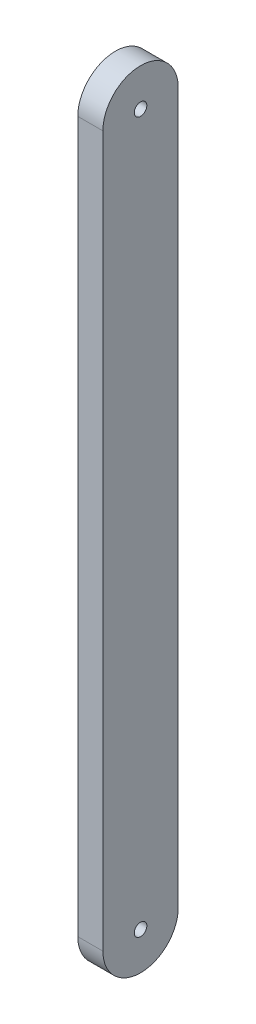
ISO-10303-21;
HEADER;
FILE_DESCRIPTION(('STEP AP214'),'2;1');
FILE_NAME('part.step','',(''),(''),'','','');
FILE_SCHEMA(('AUTOMOTIVE_DESIGN { 1 0 10303 214 1 1 1 1 }'));
ENDSEC;
DATA;
#1=APPLICATION_CONTEXT('core data for automotive mechanical design processes');
#2=APPLICATION_PROTOCOL_DEFINITION('international standard','automotive_design',2000,#1);
#3=PRODUCT_CONTEXT('',#1,'mechanical');
#4=PRODUCT('Part','Part','',(#3));
#5=PRODUCT_RELATED_PRODUCT_CATEGORY('part','',(#4));
#6=PRODUCT_DEFINITION_FORMATION('','',#4);
#7=PRODUCT_DEFINITION_CONTEXT('part definition',#1,'design');
#8=PRODUCT_DEFINITION('design','',#6,#7);
#9=PRODUCT_DEFINITION_SHAPE('','',#8);
#10=(LENGTH_UNIT() NAMED_UNIT(*) SI_UNIT(.MILLI.,.METRE.));
#11=(NAMED_UNIT(*) PLANE_ANGLE_UNIT() SI_UNIT($,.RADIAN.));
#12=(NAMED_UNIT(*) SI_UNIT($,.STERADIAN.) SOLID_ANGLE_UNIT());
#13=UNCERTAINTY_MEASURE_WITH_UNIT(LENGTH_MEASURE(1.E-05),#10,'distance_accuracy_value','');
#14=(GEOMETRIC_REPRESENTATION_CONTEXT(3) GLOBAL_UNCERTAINTY_ASSIGNED_CONTEXT((#13)) GLOBAL_UNIT_ASSIGNED_CONTEXT((#10,
#11,#12)) REPRESENTATION_CONTEXT('',''));
#15=CARTESIAN_POINT('',(0.,0.,0.));
#16=DIRECTION('',(0.,0.,1.));
#17=DIRECTION('',(1.,0.,0.));
#18=AXIS2_PLACEMENT_3D('',#15,#16,#17);
#19=CARTESIAN_POINT('',(10.,0.,-14.9999999999999));
#20=DIRECTION('',(-1.,0.,0.));
#21=DIRECTION('',(0.,0.,1.));
#22=AXIS2_PLACEMENT_3D('',#19,#20,#21);
#23=CYLINDRICAL_SURFACE('',#22,15.);
#24=CARTESIAN_POINT('',(0.,0.,-14.9999999999999));
#25=DIRECTION('',(1.,0.,0.));
#26=DIRECTION('',(0.,0.,-1.));
#27=AXIS2_PLACEMENT_3D('',#24,#25,#26);
#28=CIRCLE('',#27,15.);
#29=CARTESIAN_POINT('',(0.,0.,0.));
#30=VERTEX_POINT('',#29);
#31=CARTESIAN_POINT('',(0.,0.,-30.));
#32=VERTEX_POINT('',#31);
#33=EDGE_CURVE('E106',#30,#32,#28,.T.);
#34=ORIENTED_EDGE('',*,*,#33,.T.);
#35=DIRECTION('',(-1.,0.,0.));
#36=VECTOR('',#35,1.);
#37=CARTESIAN_POINT('',(10.,0.,-30.));
#38=LINE('',#37,#36);
#39=CARTESIAN_POINT('',(10.,0.,-30.));
#40=VERTEX_POINT('',#39);
#41=EDGE_CURVE('E11',#40,#32,#38,.T.);
#42=ORIENTED_EDGE('',*,*,#41,.F.);
#43=CARTESIAN_POINT('',(10.,0.,-14.9999999999999));
#44=DIRECTION('',(1.,0.,0.));
#45=DIRECTION('',(0.,0.,-1.));
#46=AXIS2_PLACEMENT_3D('',#43,#44,#45);
#47=CIRCLE('',#46,15.);
#48=CARTESIAN_POINT('',(10.,0.,0.));
#49=VERTEX_POINT('',#48);
#50=EDGE_CURVE('E94',#49,#40,#47,.T.);
#51=ORIENTED_EDGE('',*,*,#50,.F.);
#52=DIRECTION('',(-1.,0.,0.));
#53=VECTOR('',#52,1.);
#54=CARTESIAN_POINT('',(10.,0.,0.));
#55=LINE('',#54,#53);
#56=EDGE_CURVE('E102',#49,#30,#55,.T.);
#57=ORIENTED_EDGE('',*,*,#56,.T.);
#58=EDGE_LOOP('',(#34,#42,#51,#57));
#59=FACE_BOUND('',#58,.T.);
#60=ADVANCED_FACE('F43',(#59),#23,.T.);
#61=CARTESIAN_POINT('',(10.,282.909,-30.));
#62=DIRECTION('',(0.,0.,1.));
#63=DIRECTION('',(1.,0.,0.));
#64=AXIS2_PLACEMENT_3D('',#61,#62,#63);
#65=PLANE('',#64);
#66=DIRECTION('',(0.,1.,0.));
#67=VECTOR('',#66,1.);
#68=CARTESIAN_POINT('',(0.,282.909,-30.));
#69=LINE('',#68,#67);
#70=CARTESIAN_POINT('',(0.,282.909,-30.));
#71=VERTEX_POINT('',#70);
#72=EDGE_CURVE('E98',#32,#71,#69,.T.);
#73=ORIENTED_EDGE('',*,*,#72,.T.);
#74=DIRECTION('',(-1.,0.,0.));
#75=VECTOR('',#74,1.);
#76=CARTESIAN_POINT('',(10.,282.909,-30.));
#77=LINE('',#76,#75);
#78=CARTESIAN_POINT('',(10.,282.909,-30.));
#79=VERTEX_POINT('',#78);
#80=EDGE_CURVE('E51',#79,#71,#77,.T.);
#81=ORIENTED_EDGE('',*,*,#80,.F.);
#82=DIRECTION('',(0.,1.,0.));
#83=VECTOR('',#82,1.);
#84=CARTESIAN_POINT('',(10.,282.909,-30.));
#85=LINE('',#84,#83);
#86=EDGE_CURVE('E89',#40,#79,#85,.T.);
#87=ORIENTED_EDGE('',*,*,#86,.F.);
#88=ORIENTED_EDGE('',*,*,#41,.T.);
#89=EDGE_LOOP('',(#73,#81,#87,#88));
#90=FACE_BOUND('',#89,.T.);
#91=ADVANCED_FACE('F97',(#90),#65,.F.);
#92=CARTESIAN_POINT('',(10.,282.909,-14.9999999999999));
#93=DIRECTION('',(-1.,0.,0.));
#94=DIRECTION('',(0.,0.,1.));
#95=AXIS2_PLACEMENT_3D('',#92,#93,#94);
#96=CYLINDRICAL_SURFACE('',#95,15.);
#97=CARTESIAN_POINT('',(0.,282.909,-14.9999999999999));
#98=DIRECTION('',(1.,0.,0.));
#99=DIRECTION('',(0.,0.,1.));
#100=AXIS2_PLACEMENT_3D('',#97,#98,#99);
#101=CIRCLE('',#100,15.);
#102=CARTESIAN_POINT('',(0.,282.909,0.));
#103=VERTEX_POINT('',#102);
#104=EDGE_CURVE('E76',#71,#103,#101,.T.);
#105=ORIENTED_EDGE('',*,*,#104,.T.);
#106=DIRECTION('',(-1.,0.,0.));
#107=VECTOR('',#106,1.);
#108=CARTESIAN_POINT('',(10.,282.909,0.));
#109=LINE('',#108,#107);
#110=CARTESIAN_POINT('',(10.,282.909,0.));
#111=VERTEX_POINT('',#110);
#112=EDGE_CURVE('E99',#111,#103,#109,.T.);
#113=ORIENTED_EDGE('',*,*,#112,.F.);
#114=CARTESIAN_POINT('',(10.,282.909,-14.9999999999999));
#115=DIRECTION('',(1.,0.,0.));
#116=DIRECTION('',(0.,0.,1.));
#117=AXIS2_PLACEMENT_3D('',#114,#115,#116);
#118=CIRCLE('',#117,15.);
#119=EDGE_CURVE('E92',#79,#111,#118,.T.);
#120=ORIENTED_EDGE('',*,*,#119,.F.);
#121=ORIENTED_EDGE('',*,*,#80,.T.);
#122=EDGE_LOOP('',(#105,#113,#120,#121));
#123=FACE_BOUND('',#122,.T.);
#124=ADVANCED_FACE('F100',(#123),#96,.T.);
#125=CARTESIAN_POINT('',(10.,0.,0.));
#126=DIRECTION('',(0.,0.,-1.));
#127=DIRECTION('',(-1.,0.,0.));
#128=AXIS2_PLACEMENT_3D('',#125,#126,#127);
#129=PLANE('',#128);
#130=DIRECTION('',(0.,-1.,0.));
#131=VECTOR('',#130,1.);
#132=CARTESIAN_POINT('',(0.,0.,0.));
#133=LINE('',#132,#131);
#134=EDGE_CURVE('E82',#103,#30,#133,.T.);
#135=ORIENTED_EDGE('',*,*,#134,.T.);
#136=ORIENTED_EDGE('',*,*,#56,.F.);
#137=DIRECTION('',(0.,-1.,0.));
#138=VECTOR('',#137,1.);
#139=CARTESIAN_POINT('',(10.,0.,0.));
#140=LINE('',#139,#138);
#141=EDGE_CURVE('E59',#111,#49,#140,.T.);
#142=ORIENTED_EDGE('',*,*,#141,.F.);
#143=ORIENTED_EDGE('',*,*,#112,.T.);
#144=EDGE_LOOP('',(#135,#136,#142,#143));
#145=FACE_BOUND('',#144,.T.);
#146=ADVANCED_FACE('F114',(#145),#129,.F.);
#147=CARTESIAN_POINT('',(10.,0.,-14.9999999999999));
#148=DIRECTION('',(1.,0.,0.));
#149=DIRECTION('',(0.,0.,-1.));
#150=AXIS2_PLACEMENT_3D('',#147,#148,#149);
#151=PLANE('',#150);
#152=CARTESIAN_POINT('',(10.,0.,-14.9999999999999));
#153=DIRECTION('',(-1.,0.,0.));
#154=DIRECTION('',(0.,0.,1.));
#155=AXIS2_PLACEMENT_3D('',#152,#153,#154);
#156=CIRCLE('',#155,2.5);
#157=CARTESIAN_POINT('',(10.,0.,-12.4999999999999));
#158=VERTEX_POINT('',#157);
#159=EDGE_CURVE('E109',#158,#158,#156,.T.);
#160=ORIENTED_EDGE('',*,*,#159,.T.);
#161=EDGE_LOOP('',(#160));
#162=FACE_BOUND('',#161,.T.);
#163=CARTESIAN_POINT('',(10.,282.909,-14.9999999999999));
#164=DIRECTION('',(-1.,0.,0.));
#165=DIRECTION('',(0.,0.,-1.));
#166=AXIS2_PLACEMENT_3D('',#163,#164,#165);
#167=CIRCLE('',#166,2.5);
#168=CARTESIAN_POINT('',(10.,282.909,-17.4999999999999));
#169=VERTEX_POINT('',#168);
#170=EDGE_CURVE('E120',#169,#169,#167,.T.);
#171=ORIENTED_EDGE('',*,*,#170,.T.);
#172=EDGE_LOOP('',(#171));
#173=FACE_BOUND('',#172,.T.);
#174=ORIENTED_EDGE('',*,*,#50,.T.);
#175=ORIENTED_EDGE('',*,*,#86,.T.);
#176=ORIENTED_EDGE('',*,*,#119,.T.);
#177=ORIENTED_EDGE('',*,*,#141,.T.);
#178=EDGE_LOOP('',(#174,#175,#176,#177));
#179=FACE_BOUND('',#178,.T.);
#180=ADVANCED_FACE('F90',(#162,#173,#179),#151,.T.);
#181=CARTESIAN_POINT('',(0.,0.,-14.9999999999999));
#182=DIRECTION('',(1.,0.,0.));
#183=DIRECTION('',(0.,0.,-1.));
#184=AXIS2_PLACEMENT_3D('',#181,#182,#183);
#185=PLANE('',#184);
#186=CARTESIAN_POINT('',(0.,0.,-14.9999999999999));
#187=DIRECTION('',(-1.,0.,0.));
#188=DIRECTION('',(0.,0.,1.));
#189=AXIS2_PLACEMENT_3D('',#186,#187,#188);
#190=CIRCLE('',#189,2.5);
#191=CARTESIAN_POINT('',(0.,0.,-12.4999999999999));
#192=VERTEX_POINT('',#191);
#193=EDGE_CURVE('E126',#192,#192,#190,.T.);
#194=ORIENTED_EDGE('',*,*,#193,.F.);
#195=EDGE_LOOP('',(#194));
#196=FACE_BOUND('',#195,.T.);
#197=CARTESIAN_POINT('',(0.,282.909,-14.9999999999999));
#198=DIRECTION('',(-1.,0.,0.));
#199=DIRECTION('',(0.,0.,-1.));
#200=AXIS2_PLACEMENT_3D('',#197,#198,#199);
#201=CIRCLE('',#200,2.5);
#202=CARTESIAN_POINT('',(0.,282.909,-17.4999999999999));
#203=VERTEX_POINT('',#202);
#204=EDGE_CURVE('E123',#203,#203,#201,.T.);
#205=ORIENTED_EDGE('',*,*,#204,.F.);
#206=EDGE_LOOP('',(#205));
#207=FACE_BOUND('',#206,.T.);
#208=ORIENTED_EDGE('',*,*,#33,.F.);
#209=ORIENTED_EDGE('',*,*,#134,.F.);
#210=ORIENTED_EDGE('',*,*,#104,.F.);
#211=ORIENTED_EDGE('',*,*,#72,.F.);
#212=EDGE_LOOP('',(#208,#209,#210,#211));
#213=FACE_BOUND('',#212,.T.);
#214=ADVANCED_FACE('F117',(#196,#207,#213),#185,.F.);
#215=CARTESIAN_POINT('',(10.,282.909,-14.9999999999999));
#216=DIRECTION('',(-1.,0.,0.));
#217=DIRECTION('',(0.,0.,1.));
#218=AXIS2_PLACEMENT_3D('',#215,#216,#217);
#219=CYLINDRICAL_SURFACE('',#218,2.5);
#220=ORIENTED_EDGE('',*,*,#170,.F.);
#221=EDGE_LOOP('',(#220));
#222=FACE_BOUND('',#221,.T.);
#223=ORIENTED_EDGE('',*,*,#204,.T.);
#224=EDGE_LOOP('',(#223));
#225=FACE_BOUND('',#224,.T.);
#226=ADVANCED_FACE('F137',(#222,#225),#219,.F.);
#227=CARTESIAN_POINT('',(10.,0.,-14.9999999999999));
#228=DIRECTION('',(-1.,0.,0.));
#229=DIRECTION('',(0.,0.,1.));
#230=AXIS2_PLACEMENT_3D('',#227,#228,#229);
#231=CYLINDRICAL_SURFACE('',#230,2.5);
#232=ORIENTED_EDGE('',*,*,#159,.F.);
#233=EDGE_LOOP('',(#232));
#234=FACE_BOUND('',#233,.T.);
#235=ORIENTED_EDGE('',*,*,#193,.T.);
#236=EDGE_LOOP('',(#235));
#237=FACE_BOUND('',#236,.T.);
#238=ADVANCED_FACE('F134',(#234,#237),#231,.F.);
#239=CLOSED_SHELL('',(#60,#91,#124,#146,#180,#214,#226,#238));
#240=MANIFOLD_SOLID_BREP('B2',#239);
#241=ADVANCED_BREP_SHAPE_REPRESENTATION('',(#18,#240),#14);
#242=SHAPE_DEFINITION_REPRESENTATION(#9,#241);
ENDSEC;
END-ISO-10303-21;
